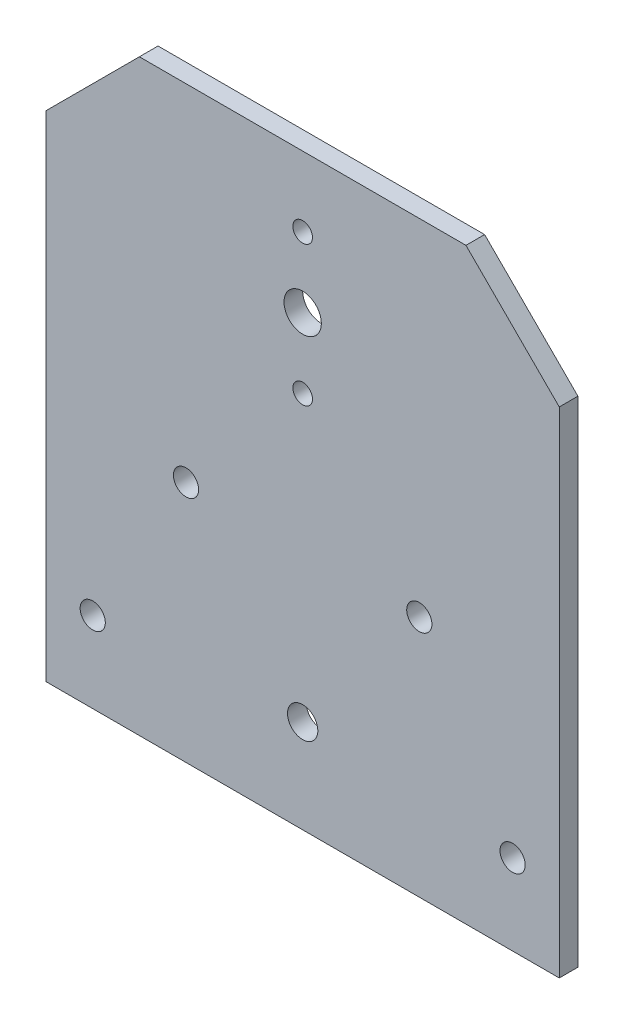
ISO-10303-21;
HEADER;
FILE_DESCRIPTION(('STEP AP214'),'2;1');
FILE_NAME('part.step','',(''),(''),'','','');
FILE_SCHEMA(('AUTOMOTIVE_DESIGN { 1 0 10303 214 1 1 1 1 }'));
ENDSEC;
DATA;
#1=APPLICATION_CONTEXT('core data for automotive mechanical design processes');
#2=APPLICATION_PROTOCOL_DEFINITION('international standard','automotive_design',2000,#1);
#3=PRODUCT_CONTEXT('',#1,'mechanical');
#4=PRODUCT('Part','Part','',(#3));
#5=PRODUCT_RELATED_PRODUCT_CATEGORY('part','',(#4));
#6=PRODUCT_DEFINITION_FORMATION('','',#4);
#7=PRODUCT_DEFINITION_CONTEXT('part definition',#1,'design');
#8=PRODUCT_DEFINITION('design','',#6,#7);
#9=PRODUCT_DEFINITION_SHAPE('','',#8);
#10=(LENGTH_UNIT() NAMED_UNIT(*) SI_UNIT(.MILLI.,.METRE.));
#11=(NAMED_UNIT(*) PLANE_ANGLE_UNIT() SI_UNIT($,.RADIAN.));
#12=(NAMED_UNIT(*) SI_UNIT($,.STERADIAN.) SOLID_ANGLE_UNIT());
#13=UNCERTAINTY_MEASURE_WITH_UNIT(LENGTH_MEASURE(1.E-05),#10,'distance_accuracy_value','');
#14=(GEOMETRIC_REPRESENTATION_CONTEXT(3) GLOBAL_UNCERTAINTY_ASSIGNED_CONTEXT((#13)) GLOBAL_UNIT_ASSIGNED_CONTEXT((#10,
#11,#12)) REPRESENTATION_CONTEXT('',''));
#15=CARTESIAN_POINT('',(0.,0.,0.));
#16=DIRECTION('',(0.,0.,1.));
#17=DIRECTION('',(1.,0.,0.));
#18=AXIS2_PLACEMENT_3D('',#15,#16,#17);
#19=CARTESIAN_POINT('',(-67.2661159349345,25.9721947637664,4.));
#20=DIRECTION('',(1.,0.,0.));
#21=DIRECTION('',(0.,1.,0.));
#22=AXIS2_PLACEMENT_3D('',#19,#20,#21);
#23=PLANE('',#22);
#24=DIRECTION('',(0.,-1.,0.));
#25=VECTOR('',#24,1.);
#26=CARTESIAN_POINT('',(-67.2661159349345,25.9721947637664,4.));
#27=LINE('',#26,#25);
#28=CARTESIAN_POINT('',(-67.2661159349345,5.97219476376637,4.));
#29=VERTEX_POINT('',#28);
#30=CARTESIAN_POINT('',(-67.2661159349344,-100.027805236234,4.));
#31=VERTEX_POINT('',#30);
#32=EDGE_CURVE('E100',#29,#31,#27,.T.);
#33=ORIENTED_EDGE('',*,*,#32,.F.);
#34=DIRECTION('',(0.,0.,1.));
#35=VECTOR('',#34,1.);
#36=CARTESIAN_POINT('',(-67.2661159349345,5.97219476376637,0.));
#37=LINE('',#36,#35);
#38=CARTESIAN_POINT('',(-67.2661159349345,5.97219476376637,0.));
#39=VERTEX_POINT('',#38);
#40=EDGE_CURVE('E183',#39,#29,#37,.T.);
#41=ORIENTED_EDGE('',*,*,#40,.F.);
#42=DIRECTION('',(0.,-1.,0.));
#43=VECTOR('',#42,1.);
#44=CARTESIAN_POINT('',(-67.2661159349345,25.9721947637664,0.));
#45=LINE('',#44,#43);
#46=CARTESIAN_POINT('',(-67.2661159349344,-100.027805236234,0.));
#47=VERTEX_POINT('',#46);
#48=EDGE_CURVE('E121',#39,#47,#45,.T.);
#49=ORIENTED_EDGE('',*,*,#48,.T.);
#50=DIRECTION('',(0.,0.,-1.));
#51=VECTOR('',#50,1.);
#52=CARTESIAN_POINT('',(-67.2661159349344,-100.027805236234,4.));
#53=LINE('',#52,#51);
#54=EDGE_CURVE('E11',#31,#47,#53,.T.);
#55=ORIENTED_EDGE('',*,*,#54,.F.);
#56=EDGE_LOOP('',(#33,#41,#49,#55));
#57=FACE_BOUND('',#56,.T.);
#58=ADVANCED_FACE('F32',(#57),#23,.F.);
#59=CARTESIAN_POINT('',(-67.2661159349344,-100.027805236234,4.));
#60=DIRECTION('',(0.,1.,0.));
#61=DIRECTION('',(0.,0.,1.));
#62=AXIS2_PLACEMENT_3D('',#59,#60,#61);
#63=PLANE('',#62);
#64=DIRECTION('',(1.,0.,0.));
#65=VECTOR('',#64,1.);
#66=CARTESIAN_POINT('',(-67.2661159349344,-100.027805236234,0.));
#67=LINE('',#66,#65);
#68=CARTESIAN_POINT('',(42.7338840650655,-100.027805236234,0.));
#69=VERTEX_POINT('',#68);
#70=EDGE_CURVE('E105',#47,#69,#67,.T.);
#71=ORIENTED_EDGE('',*,*,#70,.T.);
#72=DIRECTION('',(0.,0.,-1.));
#73=VECTOR('',#72,1.);
#74=CARTESIAN_POINT('',(42.7338840650655,-100.027805236234,4.));
#75=LINE('',#74,#73);
#76=CARTESIAN_POINT('',(42.7338840650655,-100.027805236234,4.));
#77=VERTEX_POINT('',#76);
#78=EDGE_CURVE('E39',#77,#69,#75,.T.);
#79=ORIENTED_EDGE('',*,*,#78,.F.);
#80=DIRECTION('',(1.,0.,0.));
#81=VECTOR('',#80,1.);
#82=CARTESIAN_POINT('',(-67.2661159349344,-100.027805236234,4.));
#83=LINE('',#82,#81);
#84=EDGE_CURVE('E103',#31,#77,#83,.T.);
#85=ORIENTED_EDGE('',*,*,#84,.F.);
#86=ORIENTED_EDGE('',*,*,#54,.T.);
#87=EDGE_LOOP('',(#71,#79,#85,#86));
#88=FACE_BOUND('',#87,.T.);
#89=ADVANCED_FACE('F125',(#88),#63,.F.);
#90=CARTESIAN_POINT('',(42.7338840650655,25.9721947637664,4.));
#91=DIRECTION('',(-1.,0.,0.));
#92=DIRECTION('',(0.,-1.,0.));
#93=AXIS2_PLACEMENT_3D('',#90,#91,#92);
#94=PLANE('',#93);
#95=DIRECTION('',(0.,1.,0.));
#96=VECTOR('',#95,1.);
#97=CARTESIAN_POINT('',(42.7338840650655,25.9721947637664,0.));
#98=LINE('',#97,#96);
#99=CARTESIAN_POINT('',(42.7338840650655,5.97219476376644,0.));
#100=VERTEX_POINT('',#99);
#101=EDGE_CURVE('E101',#69,#100,#98,.T.);
#102=ORIENTED_EDGE('',*,*,#101,.T.);
#103=DIRECTION('',(0.,0.,1.));
#104=VECTOR('',#103,1.);
#105=CARTESIAN_POINT('',(42.7338840650655,5.97219476376637,0.));
#106=LINE('',#105,#104);
#107=CARTESIAN_POINT('',(42.7338840650655,5.97219476376637,4.));
#108=VERTEX_POINT('',#107);
#109=EDGE_CURVE('E46',#100,#108,#106,.T.);
#110=ORIENTED_EDGE('',*,*,#109,.T.);
#111=DIRECTION('',(0.,1.,0.));
#112=VECTOR('',#111,1.);
#113=CARTESIAN_POINT('',(42.7338840650655,25.9721947637664,4.));
#114=LINE('',#113,#112);
#115=EDGE_CURVE('E112',#77,#108,#114,.T.);
#116=ORIENTED_EDGE('',*,*,#115,.F.);
#117=ORIENTED_EDGE('',*,*,#78,.T.);
#118=EDGE_LOOP('',(#102,#110,#116,#117));
#119=FACE_BOUND('',#118,.T.);
#120=ADVANCED_FACE('F128',(#119),#94,.F.);
#121=CARTESIAN_POINT('',(-67.2661159349345,25.9721947637664,4.));
#122=DIRECTION('',(0.,-1.,0.));
#123=DIRECTION('',(0.,0.,-1.));
#124=AXIS2_PLACEMENT_3D('',#121,#122,#123);
#125=PLANE('',#124);
#126=DIRECTION('',(-1.,0.,0.));
#127=VECTOR('',#126,1.);
#128=CARTESIAN_POINT('',(-67.2661159349345,25.9721947637664,4.));
#129=LINE('',#128,#127);
#130=CARTESIAN_POINT('',(22.7338840650655,25.9721947637664,4.));
#131=VERTEX_POINT('',#130);
#132=CARTESIAN_POINT('',(-47.2661159349345,25.9721947637664,4.));
#133=VERTEX_POINT('',#132);
#134=EDGE_CURVE('E94',#131,#133,#129,.T.);
#135=ORIENTED_EDGE('',*,*,#134,.F.);
#136=DIRECTION('',(0.,0.,1.));
#137=VECTOR('',#136,1.);
#138=CARTESIAN_POINT('',(22.7338840650655,25.9721947637664,0.));
#139=LINE('',#138,#137);
#140=CARTESIAN_POINT('',(22.7338840650655,25.9721947637664,0.));
#141=VERTEX_POINT('',#140);
#142=EDGE_CURVE('E85',#141,#131,#139,.T.);
#143=ORIENTED_EDGE('',*,*,#142,.F.);
#144=DIRECTION('',(-1.,0.,0.));
#145=VECTOR('',#144,1.);
#146=CARTESIAN_POINT('',(-67.2661159349345,25.9721947637664,0.));
#147=LINE('',#146,#145);
#148=CARTESIAN_POINT('',(-47.2661159349345,25.9721947637664,0.));
#149=VERTEX_POINT('',#148);
#150=EDGE_CURVE('E54',#141,#149,#147,.T.);
#151=ORIENTED_EDGE('',*,*,#150,.T.);
#152=DIRECTION('',(0.,0.,1.));
#153=VECTOR('',#152,1.);
#154=CARTESIAN_POINT('',(-47.2661159349345,25.9721947637664,0.));
#155=LINE('',#154,#153);
#156=EDGE_CURVE('E180',#149,#133,#155,.T.);
#157=ORIENTED_EDGE('',*,*,#156,.T.);
#158=EDGE_LOOP('',(#135,#143,#151,#157));
#159=FACE_BOUND('',#158,.T.);
#160=ADVANCED_FACE('F93',(#159),#125,.F.);
#161=CARTESIAN_POINT('',(-67.2661159349344,-100.027805236234,4.));
#162=DIRECTION('',(0.,0.,1.));
#163=DIRECTION('',(1.,0.,0.));
#164=AXIS2_PLACEMENT_3D('',#161,#162,#163);
#165=PLANE('',#164);
#166=DIRECTION('',(0.707106781186548,-0.707106781186547,0.));
#167=VECTOR('',#166,1.);
#168=CARTESIAN_POINT('',(22.7338840650655,25.9721947637664,4.));
#169=LINE('',#168,#167);
#170=EDGE_CURVE('E90',#131,#108,#169,.T.);
#171=ORIENTED_EDGE('',*,*,#170,.F.);
#172=ORIENTED_EDGE('',*,*,#134,.T.);
#173=DIRECTION('',(0.707106781186548,0.707106781186547,0.));
#174=VECTOR('',#173,1.);
#175=CARTESIAN_POINT('',(-67.2661159349345,5.97219476376637,4.));
#176=LINE('',#175,#174);
#177=EDGE_CURVE('E129',#29,#133,#176,.T.);
#178=ORIENTED_EDGE('',*,*,#177,.F.);
#179=ORIENTED_EDGE('',*,*,#32,.T.);
#180=ORIENTED_EDGE('',*,*,#84,.T.);
#181=ORIENTED_EDGE('',*,*,#115,.T.);
#182=EDGE_LOOP('',(#171,#172,#178,#179,#180,#181));
#183=FACE_BOUND('',#182,.T.);
#184=CARTESIAN_POINT('',(-12.2661159349345,-19.0278052362336,4.));
#185=DIRECTION('',(0.,0.,1.));
#186=DIRECTION('',(1.,0.,0.));
#187=AXIS2_PLACEMENT_3D('',#184,#185,#186);
#188=CIRCLE('',#187,2.1);
#189=CARTESIAN_POINT('',(-10.1661159349345,-19.0278052362336,4.));
#190=VERTEX_POINT('',#189);
#191=EDGE_CURVE('E177',#190,#190,#188,.T.);
#192=ORIENTED_EDGE('',*,*,#191,.F.);
#193=EDGE_LOOP('',(#192));
#194=FACE_BOUND('',#193,.T.);
#195=CARTESIAN_POINT('',(-12.2661159349345,-4.02780523623363,4.));
#196=DIRECTION('',(0.,0.,1.));
#197=DIRECTION('',(1.,0.,0.));
#198=AXIS2_PLACEMENT_3D('',#195,#196,#197);
#199=CIRCLE('',#198,4.);
#200=CARTESIAN_POINT('',(-8.26611593493446,-4.02780523623363,4.));
#201=VERTEX_POINT('',#200);
#202=EDGE_CURVE('E171',#201,#201,#199,.T.);
#203=ORIENTED_EDGE('',*,*,#202,.F.);
#204=EDGE_LOOP('',(#203));
#205=FACE_BOUND('',#204,.T.);
#206=CARTESIAN_POINT('',(-12.2661159349345,10.9721947637664,4.));
#207=DIRECTION('',(0.,0.,1.));
#208=DIRECTION('',(1.,0.,0.));
#209=AXIS2_PLACEMENT_3D('',#206,#207,#208);
#210=CIRCLE('',#209,2.1);
#211=CARTESIAN_POINT('',(-10.1661159349345,10.9721947637664,4.));
#212=VERTEX_POINT('',#211);
#213=EDGE_CURVE('E165',#212,#212,#210,.T.);
#214=ORIENTED_EDGE('',*,*,#213,.F.);
#215=EDGE_LOOP('',(#214));
#216=FACE_BOUND('',#215,.T.);
#217=CARTESIAN_POINT('',(-57.2661159349344,-82.7278052362336,4.));
#218=DIRECTION('',(0.,0.,1.));
#219=DIRECTION('',(1.,0.,0.));
#220=AXIS2_PLACEMENT_3D('',#217,#218,#219);
#221=CIRCLE('',#220,2.7);
#222=CARTESIAN_POINT('',(-54.5661159349344,-82.7278052362336,4.));
#223=VERTEX_POINT('',#222);
#224=EDGE_CURVE('E159',#223,#223,#221,.T.);
#225=ORIENTED_EDGE('',*,*,#224,.F.);
#226=EDGE_LOOP('',(#225));
#227=FACE_BOUND('',#226,.T.);
#228=CARTESIAN_POINT('',(32.7338840650655,-82.7278052362336,4.));
#229=DIRECTION('',(0.,0.,1.));
#230=DIRECTION('',(1.,0.,0.));
#231=AXIS2_PLACEMENT_3D('',#228,#229,#230);
#232=CIRCLE('',#231,2.7);
#233=CARTESIAN_POINT('',(35.4338840650655,-82.7278052362336,4.));
#234=VERTEX_POINT('',#233);
#235=EDGE_CURVE('E153',#234,#234,#232,.T.);
#236=ORIENTED_EDGE('',*,*,#235,.F.);
#237=EDGE_LOOP('',(#236));
#238=FACE_BOUND('',#237,.T.);
#239=CARTESIAN_POINT('',(-37.2661159349345,-48.0278052362336,4.));
#240=DIRECTION('',(0.,0.,1.));
#241=DIRECTION('',(1.,0.,0.));
#242=AXIS2_PLACEMENT_3D('',#239,#240,#241);
#243=CIRCLE('',#242,2.7);
#244=CARTESIAN_POINT('',(-34.5661159349345,-48.0278052362336,4.));
#245=VERTEX_POINT('',#244);
#246=EDGE_CURVE('E147',#245,#245,#243,.T.);
#247=ORIENTED_EDGE('',*,*,#246,.F.);
#248=EDGE_LOOP('',(#247));
#249=FACE_BOUND('',#248,.T.);
#250=CARTESIAN_POINT('',(-12.2661159349345,-80.0278052362336,4.));
#251=DIRECTION('',(0.,0.,1.));
#252=DIRECTION('',(1.,0.,0.));
#253=AXIS2_PLACEMENT_3D('',#250,#251,#252);
#254=CIRCLE('',#253,3.25);
#255=CARTESIAN_POINT('',(-9.01611593493446,-80.0278052362336,4.));
#256=VERTEX_POINT('',#255);
#257=EDGE_CURVE('E141',#256,#256,#254,.T.);
#258=ORIENTED_EDGE('',*,*,#257,.F.);
#259=EDGE_LOOP('',(#258));
#260=FACE_BOUND('',#259,.T.);
#261=CARTESIAN_POINT('',(12.7338840650655,-48.0278052362336,4.));
#262=DIRECTION('',(0.,0.,1.));
#263=DIRECTION('',(1.,0.,0.));
#264=AXIS2_PLACEMENT_3D('',#261,#262,#263);
#265=CIRCLE('',#264,2.7);
#266=CARTESIAN_POINT('',(15.4338840650655,-48.0278052362336,4.));
#267=VERTEX_POINT('',#266);
#268=EDGE_CURVE('E135',#267,#267,#265,.T.);
#269=ORIENTED_EDGE('',*,*,#268,.F.);
#270=EDGE_LOOP('',(#269));
#271=FACE_BOUND('',#270,.T.);
#272=ADVANCED_FACE('F131',(#183,#194,#205,#216,#227,#238,#249,#260,#271),#165,.T.);
#273=CARTESIAN_POINT('',(-67.2661159349344,-100.027805236234,0.));
#274=DIRECTION('',(0.,0.,1.));
#275=DIRECTION('',(1.,0.,0.));
#276=AXIS2_PLACEMENT_3D('',#273,#274,#275);
#277=PLANE('',#276);
#278=CARTESIAN_POINT('',(-12.2661159349345,-19.0278052362336,0.));
#279=DIRECTION('',(0.,0.,1.));
#280=DIRECTION('',(1.,0.,0.));
#281=AXIS2_PLACEMENT_3D('',#278,#279,#280);
#282=CIRCLE('',#281,2.1);
#283=CARTESIAN_POINT('',(-10.1661159349345,-19.0278052362336,0.));
#284=VERTEX_POINT('',#283);
#285=EDGE_CURVE('E174',#284,#284,#282,.T.);
#286=ORIENTED_EDGE('',*,*,#285,.T.);
#287=EDGE_LOOP('',(#286));
#288=FACE_BOUND('',#287,.T.);
#289=CARTESIAN_POINT('',(-12.2661159349345,-4.02780523623363,0.));
#290=DIRECTION('',(0.,0.,1.));
#291=DIRECTION('',(1.,0.,0.));
#292=AXIS2_PLACEMENT_3D('',#289,#290,#291);
#293=CIRCLE('',#292,4.);
#294=CARTESIAN_POINT('',(-8.26611593493446,-4.02780523623363,0.));
#295=VERTEX_POINT('',#294);
#296=EDGE_CURVE('E168',#295,#295,#293,.T.);
#297=ORIENTED_EDGE('',*,*,#296,.T.);
#298=EDGE_LOOP('',(#297));
#299=FACE_BOUND('',#298,.T.);
#300=CARTESIAN_POINT('',(-12.2661159349345,10.9721947637664,0.));
#301=DIRECTION('',(0.,0.,1.));
#302=DIRECTION('',(1.,0.,0.));
#303=AXIS2_PLACEMENT_3D('',#300,#301,#302);
#304=CIRCLE('',#303,2.1);
#305=CARTESIAN_POINT('',(-10.1661159349345,10.9721947637664,0.));
#306=VERTEX_POINT('',#305);
#307=EDGE_CURVE('E162',#306,#306,#304,.T.);
#308=ORIENTED_EDGE('',*,*,#307,.T.);
#309=EDGE_LOOP('',(#308));
#310=FACE_BOUND('',#309,.T.);
#311=CARTESIAN_POINT('',(-57.2661159349344,-82.7278052362336,0.));
#312=DIRECTION('',(0.,0.,1.));
#313=DIRECTION('',(1.,0.,0.));
#314=AXIS2_PLACEMENT_3D('',#311,#312,#313);
#315=CIRCLE('',#314,2.7);
#316=CARTESIAN_POINT('',(-54.5661159349344,-82.7278052362336,0.));
#317=VERTEX_POINT('',#316);
#318=EDGE_CURVE('E156',#317,#317,#315,.T.);
#319=ORIENTED_EDGE('',*,*,#318,.T.);
#320=EDGE_LOOP('',(#319));
#321=FACE_BOUND('',#320,.T.);
#322=CARTESIAN_POINT('',(32.7338840650655,-82.7278052362336,0.));
#323=DIRECTION('',(0.,0.,1.));
#324=DIRECTION('',(1.,0.,0.));
#325=AXIS2_PLACEMENT_3D('',#322,#323,#324);
#326=CIRCLE('',#325,2.7);
#327=CARTESIAN_POINT('',(35.4338840650655,-82.7278052362336,0.));
#328=VERTEX_POINT('',#327);
#329=EDGE_CURVE('E150',#328,#328,#326,.T.);
#330=ORIENTED_EDGE('',*,*,#329,.T.);
#331=EDGE_LOOP('',(#330));
#332=FACE_BOUND('',#331,.T.);
#333=CARTESIAN_POINT('',(-37.2661159349345,-48.0278052362336,0.));
#334=DIRECTION('',(0.,0.,1.));
#335=DIRECTION('',(1.,0.,0.));
#336=AXIS2_PLACEMENT_3D('',#333,#334,#335);
#337=CIRCLE('',#336,2.7);
#338=CARTESIAN_POINT('',(-34.5661159349345,-48.0278052362336,0.));
#339=VERTEX_POINT('',#338);
#340=EDGE_CURVE('E144',#339,#339,#337,.T.);
#341=ORIENTED_EDGE('',*,*,#340,.T.);
#342=EDGE_LOOP('',(#341));
#343=FACE_BOUND('',#342,.T.);
#344=CARTESIAN_POINT('',(-12.2661159349345,-80.0278052362336,0.));
#345=DIRECTION('',(0.,0.,1.));
#346=DIRECTION('',(1.,0.,0.));
#347=AXIS2_PLACEMENT_3D('',#344,#345,#346);
#348=CIRCLE('',#347,3.25);
#349=CARTESIAN_POINT('',(-9.01611593493446,-80.0278052362336,0.));
#350=VERTEX_POINT('',#349);
#351=EDGE_CURVE('E138',#350,#350,#348,.T.);
#352=ORIENTED_EDGE('',*,*,#351,.T.);
#353=EDGE_LOOP('',(#352));
#354=FACE_BOUND('',#353,.T.);
#355=CARTESIAN_POINT('',(12.7338840650655,-48.0278052362336,0.));
#356=DIRECTION('',(0.,0.,1.));
#357=DIRECTION('',(1.,0.,0.));
#358=AXIS2_PLACEMENT_3D('',#355,#356,#357);
#359=CIRCLE('',#358,2.7);
#360=CARTESIAN_POINT('',(15.4338840650655,-48.0278052362336,0.));
#361=VERTEX_POINT('',#360);
#362=EDGE_CURVE('E122',#361,#361,#359,.T.);
#363=ORIENTED_EDGE('',*,*,#362,.T.);
#364=EDGE_LOOP('',(#363));
#365=FACE_BOUND('',#364,.T.);
#366=ORIENTED_EDGE('',*,*,#150,.F.);
#367=DIRECTION('',(0.707106781186548,-0.707106781186547,0.));
#368=VECTOR('',#367,1.);
#369=CARTESIAN_POINT('',(22.7338840650655,25.9721947637664,0.));
#370=LINE('',#369,#368);
#371=EDGE_CURVE('E83',#141,#100,#370,.T.);
#372=ORIENTED_EDGE('',*,*,#371,.T.);
#373=ORIENTED_EDGE('',*,*,#101,.F.);
#374=ORIENTED_EDGE('',*,*,#70,.F.);
#375=ORIENTED_EDGE('',*,*,#48,.F.);
#376=DIRECTION('',(0.707106781186548,0.707106781186547,0.));
#377=VECTOR('',#376,1.);
#378=CARTESIAN_POINT('',(-67.2661159349345,5.97219476376637,0.));
#379=LINE('',#378,#377);
#380=EDGE_CURVE('E99',#39,#149,#379,.T.);
#381=ORIENTED_EDGE('',*,*,#380,.T.);
#382=EDGE_LOOP('',(#366,#372,#373,#374,#375,#381));
#383=FACE_BOUND('',#382,.T.);
#384=ADVANCED_FACE('F97',(#288,#299,#310,#321,#332,#343,#354,#365,#383),#277,.F.);
#385=CARTESIAN_POINT('',(12.7338840650655,-48.0278052362336,0.));
#386=DIRECTION('',(0.,0.,1.));
#387=DIRECTION('',(1.,0.,0.));
#388=AXIS2_PLACEMENT_3D('',#385,#386,#387);
#389=CYLINDRICAL_SURFACE('',#388,2.7);
#390=ORIENTED_EDGE('',*,*,#362,.F.);
#391=EDGE_LOOP('',(#390));
#392=FACE_BOUND('',#391,.T.);
#393=ORIENTED_EDGE('',*,*,#268,.T.);
#394=EDGE_LOOP('',(#393));
#395=FACE_BOUND('',#394,.T.);
#396=ADVANCED_FACE('F205',(#392,#395),#389,.F.);
#397=CARTESIAN_POINT('',(-12.2661159349345,-80.0278052362336,0.));
#398=DIRECTION('',(0.,0.,1.));
#399=DIRECTION('',(1.,0.,0.));
#400=AXIS2_PLACEMENT_3D('',#397,#398,#399);
#401=CYLINDRICAL_SURFACE('',#400,3.25);
#402=ORIENTED_EDGE('',*,*,#351,.F.);
#403=EDGE_LOOP('',(#402));
#404=FACE_BOUND('',#403,.T.);
#405=ORIENTED_EDGE('',*,*,#257,.T.);
#406=EDGE_LOOP('',(#405));
#407=FACE_BOUND('',#406,.T.);
#408=ADVANCED_FACE('F211',(#404,#407),#401,.F.);
#409=CARTESIAN_POINT('',(-37.2661159349345,-48.0278052362336,0.));
#410=DIRECTION('',(0.,0.,1.));
#411=DIRECTION('',(1.,0.,0.));
#412=AXIS2_PLACEMENT_3D('',#409,#410,#411);
#413=CYLINDRICAL_SURFACE('',#412,2.7);
#414=ORIENTED_EDGE('',*,*,#340,.F.);
#415=EDGE_LOOP('',(#414));
#416=FACE_BOUND('',#415,.T.);
#417=ORIENTED_EDGE('',*,*,#246,.T.);
#418=EDGE_LOOP('',(#417));
#419=FACE_BOUND('',#418,.T.);
#420=ADVANCED_FACE('F215',(#416,#419),#413,.F.);
#421=CARTESIAN_POINT('',(32.7338840650655,-82.7278052362336,0.));
#422=DIRECTION('',(0.,0.,1.));
#423=DIRECTION('',(1.,0.,0.));
#424=AXIS2_PLACEMENT_3D('',#421,#422,#423);
#425=CYLINDRICAL_SURFACE('',#424,2.7);
#426=ORIENTED_EDGE('',*,*,#329,.F.);
#427=EDGE_LOOP('',(#426));
#428=FACE_BOUND('',#427,.T.);
#429=ORIENTED_EDGE('',*,*,#235,.T.);
#430=EDGE_LOOP('',(#429));
#431=FACE_BOUND('',#430,.T.);
#432=ADVANCED_FACE('F219',(#428,#431),#425,.F.);
#433=CARTESIAN_POINT('',(-57.2661159349344,-82.7278052362336,0.));
#434=DIRECTION('',(0.,0.,1.));
#435=DIRECTION('',(1.,0.,0.));
#436=AXIS2_PLACEMENT_3D('',#433,#434,#435);
#437=CYLINDRICAL_SURFACE('',#436,2.7);
#438=ORIENTED_EDGE('',*,*,#318,.F.);
#439=EDGE_LOOP('',(#438));
#440=FACE_BOUND('',#439,.T.);
#441=ORIENTED_EDGE('',*,*,#224,.T.);
#442=EDGE_LOOP('',(#441));
#443=FACE_BOUND('',#442,.T.);
#444=ADVANCED_FACE('F223',(#440,#443),#437,.F.);
#445=CARTESIAN_POINT('',(-12.2661159349345,10.9721947637664,0.));
#446=DIRECTION('',(0.,0.,1.));
#447=DIRECTION('',(1.,0.,0.));
#448=AXIS2_PLACEMENT_3D('',#445,#446,#447);
#449=CYLINDRICAL_SURFACE('',#448,2.1);
#450=ORIENTED_EDGE('',*,*,#307,.F.);
#451=EDGE_LOOP('',(#450));
#452=FACE_BOUND('',#451,.T.);
#453=ORIENTED_EDGE('',*,*,#213,.T.);
#454=EDGE_LOOP('',(#453));
#455=FACE_BOUND('',#454,.T.);
#456=ADVANCED_FACE('F227',(#452,#455),#449,.F.);
#457=CARTESIAN_POINT('',(-12.2661159349345,-4.02780523623363,0.));
#458=DIRECTION('',(0.,0.,1.));
#459=DIRECTION('',(1.,0.,0.));
#460=AXIS2_PLACEMENT_3D('',#457,#458,#459);
#461=CYLINDRICAL_SURFACE('',#460,4.);
#462=ORIENTED_EDGE('',*,*,#296,.F.);
#463=EDGE_LOOP('',(#462));
#464=FACE_BOUND('',#463,.T.);
#465=ORIENTED_EDGE('',*,*,#202,.T.);
#466=EDGE_LOOP('',(#465));
#467=FACE_BOUND('',#466,.T.);
#468=ADVANCED_FACE('F231',(#464,#467),#461,.F.);
#469=CARTESIAN_POINT('',(-12.2661159349345,-19.0278052362336,0.));
#470=DIRECTION('',(0.,0.,1.));
#471=DIRECTION('',(1.,0.,0.));
#472=AXIS2_PLACEMENT_3D('',#469,#470,#471);
#473=CYLINDRICAL_SURFACE('',#472,2.1);
#474=ORIENTED_EDGE('',*,*,#285,.F.);
#475=EDGE_LOOP('',(#474));
#476=FACE_BOUND('',#475,.T.);
#477=ORIENTED_EDGE('',*,*,#191,.T.);
#478=EDGE_LOOP('',(#477));
#479=FACE_BOUND('',#478,.T.);
#480=ADVANCED_FACE('F235',(#476,#479),#473,.F.);
#481=CARTESIAN_POINT('',(-67.2661159349345,5.97219476376637,0.));
#482=DIRECTION('',(0.707106781186547,-0.707106781186548,0.));
#483=DIRECTION('',(0.707106781186548,0.707106781186547,0.));
#484=AXIS2_PLACEMENT_3D('',#481,#482,#483);
#485=PLANE('',#484);
#486=ORIENTED_EDGE('',*,*,#177,.T.);
#487=ORIENTED_EDGE('',*,*,#156,.F.);
#488=ORIENTED_EDGE('',*,*,#380,.F.);
#489=ORIENTED_EDGE('',*,*,#40,.T.);
#490=EDGE_LOOP('',(#486,#487,#488,#489));
#491=FACE_BOUND('',#490,.T.);
#492=ADVANCED_FACE('F189',(#491),#485,.F.);
#493=CARTESIAN_POINT('',(22.7338840650655,25.9721947637664,0.));
#494=DIRECTION('',(-0.707106781186547,-0.707106781186548,0.));
#495=DIRECTION('',(0.707106781186548,-0.707106781186547,0.));
#496=AXIS2_PLACEMENT_3D('',#493,#494,#495);
#497=PLANE('',#496);
#498=ORIENTED_EDGE('',*,*,#170,.T.);
#499=ORIENTED_EDGE('',*,*,#109,.F.);
#500=ORIENTED_EDGE('',*,*,#371,.F.);
#501=ORIENTED_EDGE('',*,*,#142,.T.);
#502=EDGE_LOOP('',(#498,#499,#500,#501));
#503=FACE_BOUND('',#502,.T.);
#504=ADVANCED_FACE('F84',(#503),#497,.F.);
#505=CLOSED_SHELL('',(#58,#89,#120,#160,#272,#384,#396,#408,#420,#432,#444,#456,#468,#480,#492,#504));
#506=MANIFOLD_SOLID_BREP('B2',#505);
#507=ADVANCED_BREP_SHAPE_REPRESENTATION('',(#18,#506),#14);
#508=SHAPE_DEFINITION_REPRESENTATION(#9,#507);
ENDSEC;
END-ISO-10303-21;
